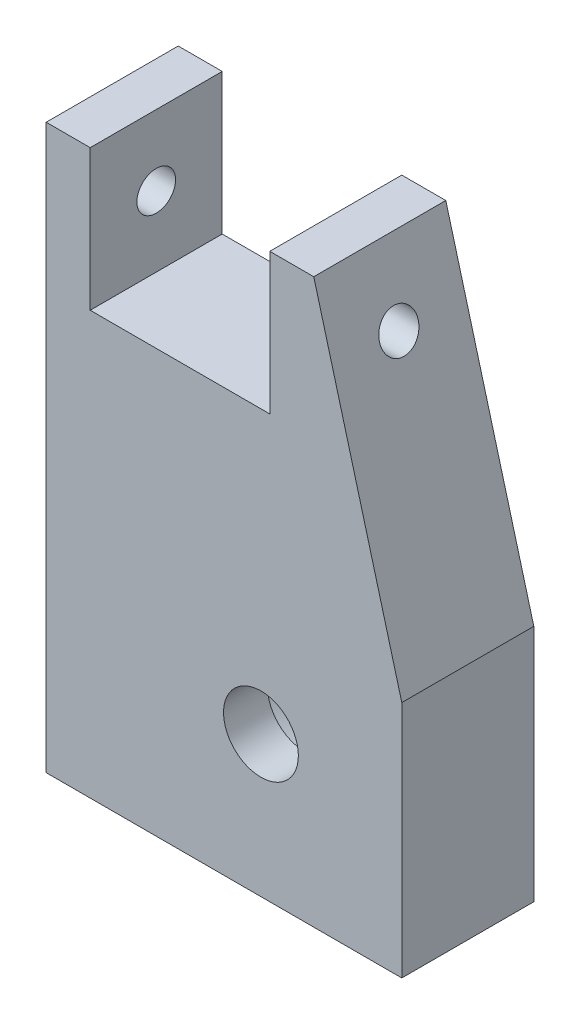
ISO-10303-21;
HEADER;
FILE_DESCRIPTION(('STEP AP214'),'2;1');
FILE_NAME('part.step','',(''),(''),'','','');
FILE_SCHEMA(('AUTOMOTIVE_DESIGN { 1 0 10303 214 1 1 1 1 }'));
ENDSEC;
DATA;
#1=APPLICATION_CONTEXT('core data for automotive mechanical design processes');
#2=APPLICATION_PROTOCOL_DEFINITION('international standard','automotive_design',2000,#1);
#3=PRODUCT_CONTEXT('',#1,'mechanical');
#4=PRODUCT('Part','Part','',(#3));
#5=PRODUCT_RELATED_PRODUCT_CATEGORY('part','',(#4));
#6=PRODUCT_DEFINITION_FORMATION('','',#4);
#7=PRODUCT_DEFINITION_CONTEXT('part definition',#1,'design');
#8=PRODUCT_DEFINITION('design','',#6,#7);
#9=PRODUCT_DEFINITION_SHAPE('','',#8);
#10=(LENGTH_UNIT() NAMED_UNIT(*) SI_UNIT(.MILLI.,.METRE.));
#11=(NAMED_UNIT(*) PLANE_ANGLE_UNIT() SI_UNIT($,.RADIAN.));
#12=(NAMED_UNIT(*) SI_UNIT($,.STERADIAN.) SOLID_ANGLE_UNIT());
#13=UNCERTAINTY_MEASURE_WITH_UNIT(LENGTH_MEASURE(1.E-05),#10,'distance_accuracy_value','');
#14=(GEOMETRIC_REPRESENTATION_CONTEXT(3) GLOBAL_UNCERTAINTY_ASSIGNED_CONTEXT((#13)) GLOBAL_UNIT_ASSIGNED_CONTEXT((#10,
#11,#12)) REPRESENTATION_CONTEXT('',''));
#15=CARTESIAN_POINT('',(0.,0.,0.));
#16=DIRECTION('',(0.,0.,1.));
#17=DIRECTION('',(1.,0.,0.));
#18=AXIS2_PLACEMENT_3D('',#15,#16,#17);
#19=CARTESIAN_POINT('',(9.2,-40.,15.));
#20=DIRECTION('',(0.,0.,-1.));
#21=DIRECTION('',(-1.,0.,0.));
#22=AXIS2_PLACEMENT_3D('',#19,#20,#21);
#23=CYLINDRICAL_SURFACE('',#22,11.1);
#24=CARTESIAN_POINT('',(9.2,-40.,0.));
#25=DIRECTION('',(0.,0.,1.));
#26=DIRECTION('',(1.,0.,0.));
#27=AXIS2_PLACEMENT_3D('',#24,#25,#26);
#28=CIRCLE('',#27,11.1);
#29=CARTESIAN_POINT('',(20.3,-40.,0.));
#30=VERTEX_POINT('',#29);
#31=EDGE_CURVE('E156',#30,#30,#28,.T.);
#32=ORIENTED_EDGE('',*,*,#31,.F.);
#33=EDGE_LOOP('',(#32));
#34=FACE_BOUND('',#33,.T.);
#35=CARTESIAN_POINT('',(9.2,-40.,10.));
#36=DIRECTION('',(0.,0.,1.));
#37=DIRECTION('',(1.,0.,0.));
#38=AXIS2_PLACEMENT_3D('',#35,#36,#37);
#39=CIRCLE('',#38,11.1);
#40=CARTESIAN_POINT('',(20.3,-40.,10.));
#41=VERTEX_POINT('',#40);
#42=EDGE_CURVE('E161',#41,#41,#39,.F.);
#43=ORIENTED_EDGE('',*,*,#42,.F.);
#44=EDGE_LOOP('',(#43));
#45=FACE_BOUND('',#44,.T.);
#46=ADVANCED_FACE('F47',(#34,#45),#23,.F.);
#47=CARTESIAN_POINT('',(25.2,0.,15.));
#48=DIRECTION('',(-1.,0.,0.));
#49=DIRECTION('',(0.,0.,1.));
#50=AXIS2_PLACEMENT_3D('',#47,#48,#49);
#51=PLANE('',#50);
#52=DIRECTION('',(0.,1.,0.));
#53=VECTOR('',#52,1.);
#54=CARTESIAN_POINT('',(25.2,0.,0.));
#55=LINE('',#54,#53);
#56=CARTESIAN_POINT('',(25.2,-56.,0.));
#57=VERTEX_POINT('',#56);
#58=CARTESIAN_POINT('',(25.2,-28.9,0.));
#59=VERTEX_POINT('',#58);
#60=EDGE_CURVE('E160',#57,#59,#55,.T.);
#61=ORIENTED_EDGE('',*,*,#60,.T.);
#62=DIRECTION('',(0.,0.,-1.));
#63=VECTOR('',#62,1.);
#64=CARTESIAN_POINT('',(25.2,-28.9,15.));
#65=LINE('',#64,#63);
#66=CARTESIAN_POINT('',(25.2,-28.9,15.));
#67=VERTEX_POINT('',#66);
#68=EDGE_CURVE('E11',#67,#59,#65,.T.);
#69=ORIENTED_EDGE('',*,*,#68,.F.);
#70=DIRECTION('',(0.,1.,0.));
#71=VECTOR('',#70,1.);
#72=CARTESIAN_POINT('',(25.2,0.,15.));
#73=LINE('',#72,#71);
#74=CARTESIAN_POINT('',(25.2,-56.,15.));
#75=VERTEX_POINT('',#74);
#76=EDGE_CURVE('E189',#75,#67,#73,.T.);
#77=ORIENTED_EDGE('',*,*,#76,.F.);
#78=DIRECTION('',(0.,0.,-1.));
#79=VECTOR('',#78,1.);
#80=CARTESIAN_POINT('',(25.2,-56.,15.));
#81=LINE('',#80,#79);
#82=EDGE_CURVE('E152',#75,#57,#81,.T.);
#83=ORIENTED_EDGE('',*,*,#82,.T.);
#84=EDGE_LOOP('',(#61,#69,#77,#83));
#85=FACE_BOUND('',#84,.T.);
#86=ADVANCED_FACE('F281',(#85),#51,.F.);
#87=CARTESIAN_POINT('',(16.1797415179152,4.384753798893,15.));
#88=DIRECTION('',(-0.965185109828666,-0.261567780441373,0.));
#89=DIRECTION('',(0.261567780441373,-0.965185109828666,0.));
#90=AXIS2_PLACEMENT_3D('',#87,#88,#89);
#91=PLANE('',#90);
#92=CARTESIAN_POINT('',(17.3680216802168,0.,7.5));
#93=DIRECTION('',(-0.965185109828666,-0.261567780441373,0.));
#94=DIRECTION('',(-0.261567780441373,0.965185109828666,0.));
#95=AXIS2_PLACEMENT_3D('',#92,#93,#94);
#96=ELLIPSE('',#95,2.27935551180491,2.2);
#97=CARTESIAN_POINT('',(16.7718157181572,2.2,7.5));
#98=VERTEX_POINT('',#97);
#99=EDGE_CURVE('E242',#98,#98,#96,.T.);
#100=ORIENTED_EDGE('',*,*,#99,.T.);
#101=EDGE_LOOP('',(#100));
#102=FACE_BOUND('',#101,.T.);
#103=DIRECTION('',(-0.261567780441373,0.965185109828666,0.));
#104=VECTOR('',#103,1.);
#105=CARTESIAN_POINT('',(16.1797415179152,4.384753798893,0.));
#106=LINE('',#105,#104);
#107=CARTESIAN_POINT('',(15.2,8.,0.));
#108=VERTEX_POINT('',#107);
#109=EDGE_CURVE('E165',#59,#108,#106,.T.);
#110=ORIENTED_EDGE('',*,*,#109,.T.);
#111=DIRECTION('',(0.,0.,-1.));
#112=VECTOR('',#111,1.);
#113=CARTESIAN_POINT('',(15.2,8.,15.));
#114=LINE('',#113,#112);
#115=CARTESIAN_POINT('',(15.2,8.,15.));
#116=VERTEX_POINT('',#115);
#117=EDGE_CURVE('E56',#116,#108,#114,.T.);
#118=ORIENTED_EDGE('',*,*,#117,.F.);
#119=DIRECTION('',(-0.261567780441373,0.965185109828666,0.));
#120=VECTOR('',#119,1.);
#121=CARTESIAN_POINT('',(16.1797415179152,4.384753798893,15.));
#122=LINE('',#121,#120);
#123=EDGE_CURVE('E110',#67,#116,#122,.T.);
#124=ORIENTED_EDGE('',*,*,#123,.F.);
#125=ORIENTED_EDGE('',*,*,#68,.T.);
#126=EDGE_LOOP('',(#110,#118,#124,#125));
#127=FACE_BOUND('',#126,.T.);
#128=ADVANCED_FACE('F288',(#102,#127),#91,.F.);
#129=CARTESIAN_POINT('',(0.,8.,15.));
#130=DIRECTION('',(0.,-1.,0.));
#131=DIRECTION('',(1.,0.,0.));
#132=AXIS2_PLACEMENT_3D('',#129,#130,#131);
#133=PLANE('',#132);
#134=DIRECTION('',(-1.,0.,0.));
#135=VECTOR('',#134,1.);
#136=CARTESIAN_POINT('',(0.,8.,0.));
#137=LINE('',#136,#135);
#138=CARTESIAN_POINT('',(10.2,8.,0.));
#139=VERTEX_POINT('',#138);
#140=EDGE_CURVE('E168',#108,#139,#137,.T.);
#141=ORIENTED_EDGE('',*,*,#140,.T.);
#142=DIRECTION('',(0.,0.,-1.));
#143=VECTOR('',#142,1.);
#144=CARTESIAN_POINT('',(10.2,8.,15.));
#145=LINE('',#144,#143);
#146=CARTESIAN_POINT('',(10.2,8.,15.));
#147=VERTEX_POINT('',#146);
#148=EDGE_CURVE('E202',#147,#139,#145,.T.);
#149=ORIENTED_EDGE('',*,*,#148,.F.);
#150=DIRECTION('',(-1.,0.,0.));
#151=VECTOR('',#150,1.);
#152=CARTESIAN_POINT('',(0.,8.,15.));
#153=LINE('',#152,#151);
#154=EDGE_CURVE('E211',#116,#147,#153,.T.);
#155=ORIENTED_EDGE('',*,*,#154,.F.);
#156=ORIENTED_EDGE('',*,*,#117,.T.);
#157=EDGE_LOOP('',(#141,#149,#155,#156));
#158=FACE_BOUND('',#157,.T.);
#159=ADVANCED_FACE('F209',(#158),#133,.F.);
#160=CARTESIAN_POINT('',(10.2,0.,15.));
#161=DIRECTION('',(-1.,0.,0.));
#162=DIRECTION('',(0.,0.,1.));
#163=AXIS2_PLACEMENT_3D('',#160,#161,#162);
#164=PLANE('',#163);
#165=CARTESIAN_POINT('',(10.2,0.,7.5));
#166=DIRECTION('',(-1.,0.,0.));
#167=DIRECTION('',(0.,0.,1.));
#168=AXIS2_PLACEMENT_3D('',#165,#166,#167);
#169=CIRCLE('',#168,2.2);
#170=CARTESIAN_POINT('',(10.2,0.,9.7));
#171=VERTEX_POINT('',#170);
#172=EDGE_CURVE('E252',#171,#171,#169,.T.);
#173=ORIENTED_EDGE('',*,*,#172,.F.);
#174=EDGE_LOOP('',(#173));
#175=FACE_BOUND('',#174,.T.);
#176=DIRECTION('',(0.,1.,0.));
#177=VECTOR('',#176,1.);
#178=CARTESIAN_POINT('',(10.2,0.,0.));
#179=LINE('',#178,#177);
#180=CARTESIAN_POINT('',(10.2,-8.,0.));
#181=VERTEX_POINT('',#180);
#182=EDGE_CURVE('E172',#181,#139,#179,.T.);
#183=ORIENTED_EDGE('',*,*,#182,.F.);
#184=DIRECTION('',(0.,0.,-1.));
#185=VECTOR('',#184,1.);
#186=CARTESIAN_POINT('',(10.2,-8.,15.));
#187=LINE('',#186,#185);
#188=CARTESIAN_POINT('',(10.2,-8.,15.));
#189=VERTEX_POINT('',#188);
#190=EDGE_CURVE('E199',#189,#181,#187,.T.);
#191=ORIENTED_EDGE('',*,*,#190,.F.);
#192=DIRECTION('',(0.,1.,0.));
#193=VECTOR('',#192,1.);
#194=CARTESIAN_POINT('',(10.2,0.,15.));
#195=LINE('',#194,#193);
#196=EDGE_CURVE('E222',#189,#147,#195,.T.);
#197=ORIENTED_EDGE('',*,*,#196,.T.);
#198=ORIENTED_EDGE('',*,*,#148,.T.);
#199=EDGE_LOOP('',(#183,#191,#197,#198));
#200=FACE_BOUND('',#199,.T.);
#201=ADVANCED_FACE('F219',(#175,#200),#164,.T.);
#202=CARTESIAN_POINT('',(0.,-8.,15.));
#203=DIRECTION('',(0.,1.,0.));
#204=DIRECTION('',(0.,0.,1.));
#205=AXIS2_PLACEMENT_3D('',#202,#203,#204);
#206=PLANE('',#205);
#207=DIRECTION('',(1.,0.,0.));
#208=VECTOR('',#207,1.);
#209=CARTESIAN_POINT('',(0.,-8.,0.));
#210=LINE('',#209,#208);
#211=CARTESIAN_POINT('',(-10.2,-8.,0.));
#212=VERTEX_POINT('',#211);
#213=EDGE_CURVE('E176',#212,#181,#210,.T.);
#214=ORIENTED_EDGE('',*,*,#213,.F.);
#215=DIRECTION('',(0.,0.,-1.));
#216=VECTOR('',#215,1.);
#217=CARTESIAN_POINT('',(-10.2,-8.,15.));
#218=LINE('',#217,#216);
#219=CARTESIAN_POINT('',(-10.2,-8.,15.));
#220=VERTEX_POINT('',#219);
#221=EDGE_CURVE('E196',#220,#212,#218,.T.);
#222=ORIENTED_EDGE('',*,*,#221,.F.);
#223=DIRECTION('',(1.,0.,0.));
#224=VECTOR('',#223,1.);
#225=CARTESIAN_POINT('',(0.,-8.,15.));
#226=LINE('',#225,#224);
#227=EDGE_CURVE('E225',#220,#189,#226,.T.);
#228=ORIENTED_EDGE('',*,*,#227,.T.);
#229=ORIENTED_EDGE('',*,*,#190,.T.);
#230=EDGE_LOOP('',(#214,#222,#228,#229));
#231=FACE_BOUND('',#230,.T.);
#232=ADVANCED_FACE('F329',(#231),#206,.T.);
#233=CARTESIAN_POINT('',(-10.2,0.,15.));
#234=DIRECTION('',(-1.,0.,0.));
#235=DIRECTION('',(0.,0.,1.));
#236=AXIS2_PLACEMENT_3D('',#233,#234,#235);
#237=PLANE('',#236);
#238=CARTESIAN_POINT('',(-10.2,0.,7.5));
#239=DIRECTION('',(-1.,0.,0.));
#240=DIRECTION('',(0.,0.,1.));
#241=AXIS2_PLACEMENT_3D('',#238,#239,#240);
#242=CIRCLE('',#241,2.2);
#243=CARTESIAN_POINT('',(-10.2,0.,9.7));
#244=VERTEX_POINT('',#243);
#245=EDGE_CURVE('E256',#244,#244,#242,.T.);
#246=ORIENTED_EDGE('',*,*,#245,.T.);
#247=EDGE_LOOP('',(#246));
#248=FACE_BOUND('',#247,.T.);
#249=DIRECTION('',(0.,1.,0.));
#250=VECTOR('',#249,1.);
#251=CARTESIAN_POINT('',(-10.2,0.,0.));
#252=LINE('',#251,#250);
#253=CARTESIAN_POINT('',(-10.2,8.,0.));
#254=VERTEX_POINT('',#253);
#255=EDGE_CURVE('E180',#212,#254,#252,.T.);
#256=ORIENTED_EDGE('',*,*,#255,.T.);
#257=DIRECTION('',(0.,0.,-1.));
#258=VECTOR('',#257,1.);
#259=CARTESIAN_POINT('',(-10.2,8.,15.));
#260=LINE('',#259,#258);
#261=CARTESIAN_POINT('',(-10.2,8.,15.));
#262=VERTEX_POINT('',#261);
#263=EDGE_CURVE('E145',#262,#254,#260,.T.);
#264=ORIENTED_EDGE('',*,*,#263,.F.);
#265=DIRECTION('',(0.,1.,0.));
#266=VECTOR('',#265,1.);
#267=CARTESIAN_POINT('',(-10.2,0.,15.));
#268=LINE('',#267,#266);
#269=EDGE_CURVE('E134',#220,#262,#268,.T.);
#270=ORIENTED_EDGE('',*,*,#269,.F.);
#271=ORIENTED_EDGE('',*,*,#221,.T.);
#272=EDGE_LOOP('',(#256,#264,#270,#271));
#273=FACE_BOUND('',#272,.T.);
#274=ADVANCED_FACE('F278',(#248,#273),#237,.F.);
#275=CARTESIAN_POINT('',(0.,8.,15.));
#276=DIRECTION('',(0.,-1.,0.));
#277=DIRECTION('',(0.,0.,-1.));
#278=AXIS2_PLACEMENT_3D('',#275,#276,#277);
#279=PLANE('',#278);
#280=DIRECTION('',(-1.,0.,0.));
#281=VECTOR('',#280,1.);
#282=CARTESIAN_POINT('',(0.,8.,0.));
#283=LINE('',#282,#281);
#284=CARTESIAN_POINT('',(-15.2,8.,0.));
#285=VERTEX_POINT('',#284);
#286=EDGE_CURVE('E143',#254,#285,#283,.T.);
#287=ORIENTED_EDGE('',*,*,#286,.T.);
#288=DIRECTION('',(0.,0.,-1.));
#289=VECTOR('',#288,1.);
#290=CARTESIAN_POINT('',(-15.2,8.,15.));
#291=LINE('',#290,#289);
#292=CARTESIAN_POINT('',(-15.2,8.,15.));
#293=VERTEX_POINT('',#292);
#294=EDGE_CURVE('E140',#293,#285,#291,.T.);
#295=ORIENTED_EDGE('',*,*,#294,.F.);
#296=DIRECTION('',(-1.,0.,0.));
#297=VECTOR('',#296,1.);
#298=CARTESIAN_POINT('',(0.,8.,15.));
#299=LINE('',#298,#297);
#300=EDGE_CURVE('E126',#262,#293,#299,.T.);
#301=ORIENTED_EDGE('',*,*,#300,.F.);
#302=ORIENTED_EDGE('',*,*,#263,.T.);
#303=EDGE_LOOP('',(#287,#295,#301,#302));
#304=FACE_BOUND('',#303,.T.);
#305=ADVANCED_FACE('F141',(#304),#279,.F.);
#306=CARTESIAN_POINT('',(-15.2,0.,15.));
#307=DIRECTION('',(1.,0.,0.));
#308=DIRECTION('',(0.,1.,0.));
#309=AXIS2_PLACEMENT_3D('',#306,#307,#308);
#310=PLANE('',#309);
#311=CARTESIAN_POINT('',(-15.2,0.,7.5));
#312=DIRECTION('',(-1.,0.,0.));
#313=DIRECTION('',(0.,-1.,0.));
#314=AXIS2_PLACEMENT_3D('',#311,#312,#313);
#315=CIRCLE('',#314,2.2);
#316=CARTESIAN_POINT('',(-15.2,-2.2,7.5));
#317=VERTEX_POINT('',#316);
#318=EDGE_CURVE('E260',#317,#317,#315,.T.);
#319=ORIENTED_EDGE('',*,*,#318,.F.);
#320=EDGE_LOOP('',(#319));
#321=FACE_BOUND('',#320,.T.);
#322=DIRECTION('',(0.,-1.,0.));
#323=VECTOR('',#322,1.);
#324=CARTESIAN_POINT('',(-15.2,0.,0.));
#325=LINE('',#324,#323);
#326=CARTESIAN_POINT('',(-15.2,-56.,0.));
#327=VERTEX_POINT('',#326);
#328=EDGE_CURVE('E96',#285,#327,#325,.T.);
#329=ORIENTED_EDGE('',*,*,#328,.T.);
#330=DIRECTION('',(0.,0.,-1.));
#331=VECTOR('',#330,1.);
#332=CARTESIAN_POINT('',(-15.2,-56.,15.));
#333=LINE('',#332,#331);
#334=CARTESIAN_POINT('',(-15.2,-56.,15.));
#335=VERTEX_POINT('',#334);
#336=EDGE_CURVE('E146',#335,#327,#333,.T.);
#337=ORIENTED_EDGE('',*,*,#336,.F.);
#338=DIRECTION('',(0.,-1.,0.));
#339=VECTOR('',#338,1.);
#340=CARTESIAN_POINT('',(-15.2,0.,15.));
#341=LINE('',#340,#339);
#342=EDGE_CURVE('E131',#293,#335,#341,.T.);
#343=ORIENTED_EDGE('',*,*,#342,.F.);
#344=ORIENTED_EDGE('',*,*,#294,.T.);
#345=EDGE_LOOP('',(#329,#337,#343,#344));
#346=FACE_BOUND('',#345,.T.);
#347=ADVANCED_FACE('F148',(#321,#346),#310,.F.);
#348=CARTESIAN_POINT('',(0.,-56.,15.));
#349=DIRECTION('',(0.,1.,0.));
#350=DIRECTION('',(0.,0.,1.));
#351=AXIS2_PLACEMENT_3D('',#348,#349,#350);
#352=PLANE('',#351);
#353=DIRECTION('',(1.,0.,0.));
#354=VECTOR('',#353,1.);
#355=CARTESIAN_POINT('',(0.,-56.,0.));
#356=LINE('',#355,#354);
#357=EDGE_CURVE('E102',#327,#57,#356,.T.);
#358=ORIENTED_EDGE('',*,*,#357,.T.);
#359=ORIENTED_EDGE('',*,*,#82,.F.);
#360=DIRECTION('',(1.,0.,0.));
#361=VECTOR('',#360,1.);
#362=CARTESIAN_POINT('',(0.,-56.,15.));
#363=LINE('',#362,#361);
#364=EDGE_CURVE('E64',#335,#75,#363,.T.);
#365=ORIENTED_EDGE('',*,*,#364,.F.);
#366=ORIENTED_EDGE('',*,*,#336,.T.);
#367=EDGE_LOOP('',(#358,#359,#365,#366));
#368=FACE_BOUND('',#367,.T.);
#369=ADVANCED_FACE('F269',(#368),#352,.F.);
#370=CARTESIAN_POINT('',(0.,0.,15.));
#371=DIRECTION('',(0.,0.,1.));
#372=DIRECTION('',(1.,0.,0.));
#373=AXIS2_PLACEMENT_3D('',#370,#371,#372);
#374=PLANE('',#373);
#375=ORIENTED_EDGE('',*,*,#76,.T.);
#376=ORIENTED_EDGE('',*,*,#123,.T.);
#377=ORIENTED_EDGE('',*,*,#154,.T.);
#378=ORIENTED_EDGE('',*,*,#196,.F.);
#379=ORIENTED_EDGE('',*,*,#227,.F.);
#380=ORIENTED_EDGE('',*,*,#269,.T.);
#381=ORIENTED_EDGE('',*,*,#300,.T.);
#382=ORIENTED_EDGE('',*,*,#342,.T.);
#383=ORIENTED_EDGE('',*,*,#364,.T.);
#384=EDGE_LOOP('',(#375,#376,#377,#378,#379,#380,#381,#382,#383));
#385=FACE_BOUND('',#384,.T.);
#386=CARTESIAN_POINT('',(9.2,-40.,15.));
#387=DIRECTION('',(0.,0.,1.));
#388=DIRECTION('',(1.,0.,0.));
#389=AXIS2_PLACEMENT_3D('',#386,#387,#388);
#390=CIRCLE('',#389,4.25);
#391=CARTESIAN_POINT('',(13.45,-40.,15.));
#392=VERTEX_POINT('',#391);
#393=EDGE_CURVE('E237',#392,#392,#390,.T.);
#394=ORIENTED_EDGE('',*,*,#393,.F.);
#395=EDGE_LOOP('',(#394));
#396=FACE_BOUND('',#395,.T.);
#397=ADVANCED_FACE('F128',(#385,#396),#374,.T.);
#398=CARTESIAN_POINT('',(0.,0.,0.));
#399=DIRECTION('',(0.,0.,1.));
#400=DIRECTION('',(1.,0.,0.));
#401=AXIS2_PLACEMENT_3D('',#398,#399,#400);
#402=PLANE('',#401);
#403=ORIENTED_EDGE('',*,*,#31,.T.);
#404=EDGE_LOOP('',(#403));
#405=FACE_BOUND('',#404,.T.);
#406=ORIENTED_EDGE('',*,*,#60,.F.);
#407=ORIENTED_EDGE('',*,*,#357,.F.);
#408=ORIENTED_EDGE('',*,*,#328,.F.);
#409=ORIENTED_EDGE('',*,*,#286,.F.);
#410=ORIENTED_EDGE('',*,*,#255,.F.);
#411=ORIENTED_EDGE('',*,*,#213,.T.);
#412=ORIENTED_EDGE('',*,*,#182,.T.);
#413=ORIENTED_EDGE('',*,*,#140,.F.);
#414=ORIENTED_EDGE('',*,*,#109,.F.);
#415=EDGE_LOOP('',(#406,#407,#408,#409,#410,#411,#412,#413,#414));
#416=FACE_BOUND('',#415,.T.);
#417=ADVANCED_FACE('F214',(#405,#416),#402,.F.);
#418=CARTESIAN_POINT('',(9.2,-40.,10.));
#419=DIRECTION('',(0.,0.,1.));
#420=DIRECTION('',(1.,0.,0.));
#421=AXIS2_PLACEMENT_3D('',#418,#419,#420);
#422=CYLINDRICAL_SURFACE('',#421,4.25);
#423=CARTESIAN_POINT('',(9.2,-40.,10.));
#424=DIRECTION('',(0.,0.,1.));
#425=DIRECTION('',(1.,0.,0.));
#426=AXIS2_PLACEMENT_3D('',#423,#424,#425);
#427=CIRCLE('',#426,4.25);
#428=CARTESIAN_POINT('',(13.45,-40.,10.));
#429=VERTEX_POINT('',#428);
#430=EDGE_CURVE('E241',#429,#429,#427,.T.);
#431=ORIENTED_EDGE('',*,*,#430,.F.);
#432=EDGE_LOOP('',(#431));
#433=FACE_BOUND('',#432,.T.);
#434=ORIENTED_EDGE('',*,*,#393,.T.);
#435=EDGE_LOOP('',(#434));
#436=FACE_BOUND('',#435,.T.);
#437=ADVANCED_FACE('F296',(#433,#436),#422,.F.);
#438=CARTESIAN_POINT('',(0.,0.,10.));
#439=DIRECTION('',(0.,0.,1.));
#440=DIRECTION('',(1.,0.,0.));
#441=AXIS2_PLACEMENT_3D('',#438,#439,#440);
#442=PLANE('',#441);
#443=ORIENTED_EDGE('',*,*,#430,.T.);
#444=EDGE_LOOP('',(#443));
#445=FACE_BOUND('',#444,.T.);
#446=ORIENTED_EDGE('',*,*,#42,.T.);
#447=EDGE_LOOP('',(#446));
#448=FACE_BOUND('',#447,.T.);
#449=ADVANCED_FACE('F294',(#445,#448),#442,.F.);
#450=CARTESIAN_POINT('',(25.2,0.,7.5));
#451=DIRECTION('',(-1.,0.,0.));
#452=DIRECTION('',(0.,-1.,0.));
#453=AXIS2_PLACEMENT_3D('',#450,#451,#452);
#454=CYLINDRICAL_SURFACE('',#453,2.2);
#455=ORIENTED_EDGE('',*,*,#318,.T.);
#456=EDGE_LOOP('',(#455));
#457=FACE_BOUND('',#456,.T.);
#458=ORIENTED_EDGE('',*,*,#245,.F.);
#459=EDGE_LOOP('',(#458));
#460=FACE_BOUND('',#459,.T.);
#461=ADVANCED_FACE('F265',(#457,#460),#454,.F.);
#462=ORIENTED_EDGE('',*,*,#172,.T.);
#463=EDGE_LOOP('',(#462));
#464=FACE_BOUND('',#463,.T.);
#465=ORIENTED_EDGE('',*,*,#99,.F.);
#466=EDGE_LOOP('',(#465));
#467=FACE_BOUND('',#466,.T.);
#468=ADVANCED_FACE('F303',(#464,#467),#454,.F.);
#469=CLOSED_SHELL('',(#46,#86,#128,#159,#201,#232,#274,#305,#347,#369,#397,#417,#437,#449,#461,#468));
#470=MANIFOLD_SOLID_BREP('B2',#469);
#471=ADVANCED_BREP_SHAPE_REPRESENTATION('',(#18,#470),#14);
#472=SHAPE_DEFINITION_REPRESENTATION(#9,#471);
ENDSEC;
END-ISO-10303-21;
